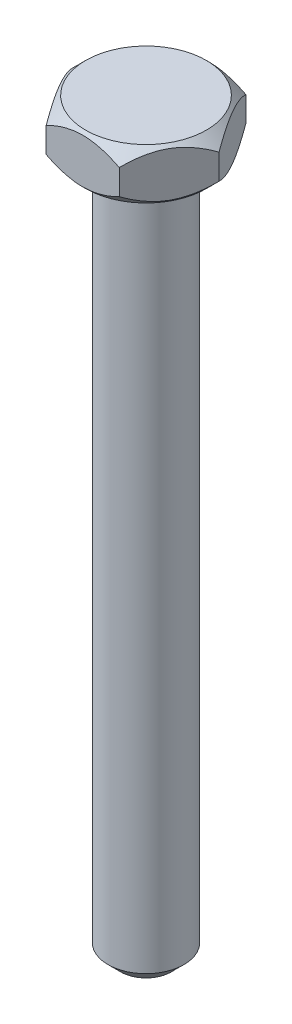
ISO-10303-21;
HEADER;
FILE_DESCRIPTION(('STEP AP214'),'2;1');
FILE_NAME('part.step','',(''),(''),'','','');
FILE_SCHEMA(('AUTOMOTIVE_DESIGN { 1 0 10303 214 1 1 1 1 }'));
ENDSEC;
DATA;
#1=APPLICATION_CONTEXT('core data for automotive mechanical design processes');
#2=APPLICATION_PROTOCOL_DEFINITION('international standard','automotive_design',2000,#1);
#3=PRODUCT_CONTEXT('',#1,'mechanical');
#4=PRODUCT('Part','Part','',(#3));
#5=PRODUCT_RELATED_PRODUCT_CATEGORY('part','',(#4));
#6=PRODUCT_DEFINITION_FORMATION('','',#4);
#7=PRODUCT_DEFINITION_CONTEXT('part definition',#1,'design');
#8=PRODUCT_DEFINITION('design','',#6,#7);
#9=PRODUCT_DEFINITION_SHAPE('','',#8);
#10=(LENGTH_UNIT() NAMED_UNIT(*) SI_UNIT(.MILLI.,.METRE.));
#11=(NAMED_UNIT(*) PLANE_ANGLE_UNIT() SI_UNIT($,.RADIAN.));
#12=(NAMED_UNIT(*) SI_UNIT($,.STERADIAN.) SOLID_ANGLE_UNIT());
#13=UNCERTAINTY_MEASURE_WITH_UNIT(LENGTH_MEASURE(1.E-05),#10,'distance_accuracy_value','');
#14=(GEOMETRIC_REPRESENTATION_CONTEXT(3) GLOBAL_UNCERTAINTY_ASSIGNED_CONTEXT((#13)) GLOBAL_UNIT_ASSIGNED_CONTEXT((#10,
#11,#12)) REPRESENTATION_CONTEXT('',''));
#15=CARTESIAN_POINT('',(0.,0.,0.));
#16=DIRECTION('',(0.,0.,1.));
#17=DIRECTION('',(1.,0.,0.));
#18=AXIS2_PLACEMENT_3D('',#15,#16,#17);
#19=CARTESIAN_POINT('',(-2.88675134594812,-4.,-4.99999999999999));
#20=DIRECTION('',(0.,-1.,0.));
#21=DIRECTION('',(0.,0.,-1.));
#22=AXIS2_PLACEMENT_3D('',#19,#20,#21);
#23=PLANE('',#22);
#24=CARTESIAN_POINT('',(0.,-4.,0.));
#25=DIRECTION('',(0.,1.,0.));
#26=DIRECTION('',(0.,0.,1.));
#27=AXIS2_PLACEMENT_3D('',#24,#25,#26);
#28=CIRCLE('',#27,4.77350269189625);
#29=CARTESIAN_POINT('',(0.,-4.,4.77350269189625));
#30=VERTEX_POINT('',#29);
#31=EDGE_CURVE('E101',#30,#30,#28,.T.);
#32=ORIENTED_EDGE('',*,*,#31,.F.);
#33=EDGE_LOOP('',(#32));
#34=FACE_BOUND('',#33,.T.);
#35=CARTESIAN_POINT('',(0.,-4.,0.));
#36=DIRECTION('',(0.,-1.,0.));
#37=DIRECTION('',(0.,0.,-1.));
#38=AXIS2_PLACEMENT_3D('',#35,#36,#37);
#39=CIRCLE('',#38,3.);
#40=CARTESIAN_POINT('',(0.,-4.,-3.));
#41=VERTEX_POINT('',#40);
#42=EDGE_CURVE('E115',#41,#41,#39,.T.);
#43=ORIENTED_EDGE('',*,*,#42,.F.);
#44=EDGE_LOOP('',(#43));
#45=FACE_BOUND('',#44,.T.);
#46=ADVANCED_FACE('F28',(#34,#45),#23,.T.);
#47=CARTESIAN_POINT('',(0.,-59.,0.));
#48=DIRECTION('',(0.,1.,0.));
#49=DIRECTION('',(0.,0.,1.));
#50=AXIS2_PLACEMENT_3D('',#47,#48,#49);
#51=CYLINDRICAL_SURFACE('',#50,3.);
#52=CARTESIAN_POINT('',(0.,-58.,0.));
#53=DIRECTION('',(0.,-1.,0.));
#54=DIRECTION('',(0.,0.,-1.));
#55=AXIS2_PLACEMENT_3D('',#52,#53,#54);
#56=CIRCLE('',#55,3.);
#57=CARTESIAN_POINT('',(0.,-58.,-3.));
#58=VERTEX_POINT('',#57);
#59=EDGE_CURVE('E41',#58,#58,#56,.F.);
#60=ORIENTED_EDGE('',*,*,#59,.T.);
#61=EDGE_LOOP('',(#60));
#62=FACE_BOUND('',#61,.T.);
#63=ORIENTED_EDGE('',*,*,#42,.T.);
#64=EDGE_LOOP('',(#63));
#65=FACE_BOUND('',#64,.T.);
#66=ADVANCED_FACE('F122',(#62,#65),#51,.T.);
#67=CARTESIAN_POINT('',(0.,-59.,0.));
#68=DIRECTION('',(0.,-1.,0.));
#69=DIRECTION('',(0.,0.,-1.));
#70=AXIS2_PLACEMENT_3D('',#67,#68,#69);
#71=PLANE('',#70);
#72=CARTESIAN_POINT('',(0.,-59.,0.));
#73=DIRECTION('',(0.,-1.,0.));
#74=DIRECTION('',(0.,0.,-1.));
#75=AXIS2_PLACEMENT_3D('',#72,#73,#74);
#76=CIRCLE('',#75,2.00000000000001);
#77=CARTESIAN_POINT('',(0.,-59.,-2.00000000000001));
#78=VERTEX_POINT('',#77);
#79=EDGE_CURVE('E116',#78,#78,#76,.T.);
#80=ORIENTED_EDGE('',*,*,#79,.T.);
#81=EDGE_LOOP('',(#80));
#82=FACE_BOUND('',#81,.T.);
#83=ADVANCED_FACE('F128',(#82),#71,.T.);
#84=CARTESIAN_POINT('',(0.,-59.,0.));
#85=DIRECTION('',(0.,1.,0.));
#86=DIRECTION('',(0.,0.,1.));
#87=AXIS2_PLACEMENT_3D('',#84,#85,#86);
#88=CONICAL_SURFACE('',#87,2.00000000000001,0.785398163397447);
#89=ORIENTED_EDGE('',*,*,#59,.F.);
#90=EDGE_LOOP('',(#89));
#91=FACE_BOUND('',#90,.T.);
#92=ORIENTED_EDGE('',*,*,#79,.F.);
#93=EDGE_LOOP('',(#92));
#94=FACE_BOUND('',#93,.T.);
#95=ADVANCED_FACE('F125',(#91,#94),#88,.T.);
#96=CARTESIAN_POINT('',(0.,-4.,0.));
#97=DIRECTION('',(0.,1.,0.));
#98=DIRECTION('',(0.,0.,1.));
#99=AXIS2_PLACEMENT_3D('',#96,#97,#98);
#100=CONICAL_SURFACE('',#99,4.77350269189625,0.785398163397448);
#101=CARTESIAN_POINT('',(-5.77361816195009,-2.99988452648213,0.000200000000039934));
#102=CARTESIAN_POINT('',(-5.72398176110225,-3.04951645439574,-0.0857727681732677));
#103=CARTESIAN_POINT('',(-5.6739638280717,-3.0976252747131,-0.17240636947177));
#104=CARTESIAN_POINT('',(-5.57309004377303,-3.19033336867022,-0.3471248890288));
#105=CARTESIAN_POINT('',(-5.52223375293569,-3.23493072549852,-0.435210568643571));
#106=CARTESIAN_POINT('',(-5.36782257743899,-3.36314092787175,-0.702658569860292));
#107=CARTESIAN_POINT('',(-5.26296050943971,-3.44062493449848,-0.884284999421792));
#108=CARTESIAN_POINT('',(-5.05149774994706,-3.57331105557449,-1.25054924277179));
#109=CARTESIAN_POINT('',(-4.94495110937142,-3.62884745935417,-1.43509343762457));
#110=CARTESIAN_POINT('',(-4.78337944338746,-3.69308950595249,-1.71494377217234));
#111=CARTESIAN_POINT('',(-4.72928433986568,-3.71131783666137,-1.80863923991277));
#112=CARTESIAN_POINT('',(-4.62063609179559,-3.74100781287389,-1.9968235257235));
#113=CARTESIAN_POINT('',(-4.56608301694085,-3.75247046969492,-2.09131222308102));
#114=CARTESIAN_POINT('',(-4.43314578685872,-3.77168913825403,-2.32156625980075));
#115=CARTESIAN_POINT('',(-4.35461839928598,-3.7757217117403,-2.4575796848624));
#116=CARTESIAN_POINT('',(-4.19770514602325,-3.7689541458947,-2.72936141189436));
#117=CARTESIAN_POINT('',(-4.11931933958609,-3.75814880702901,-2.86512961123579));
#118=CARTESIAN_POINT('',(-3.96328672226451,-3.72234235010197,-3.13538603207472));
#119=CARTESIAN_POINT('',(-3.88564083675503,-3.69732535604175,-3.26987265077581));
#120=CARTESIAN_POINT('',(-3.73168360440634,-3.63445567501058,-3.53653439939643));
#121=CARTESIAN_POINT('',(-3.65537215571136,-3.59660397223245,-3.66870970573533));
#122=CARTESIAN_POINT('',(-3.51990355411976,-3.51873011323948,-3.90334820652228));
#123=CARTESIAN_POINT('',(-3.4604464736886,-3.480755749581,-4.00633089069876));
#124=CARTESIAN_POINT('',(-3.34259967462161,-3.39868737382607,-4.21044753419214));
#125=CARTESIAN_POINT('',(-3.28420998845894,-3.35459317589646,-4.31158143726389));
#126=CARTESIAN_POINT('',(-3.16868188148908,-3.26127361464765,-4.51168198823795));
#127=CARTESIAN_POINT('',(-3.11154017495448,-3.21206438729062,-4.61065432718707));
#128=CARTESIAN_POINT('',(-2.99831490663731,-3.109160877157,-4.80676624461303));
#129=CARTESIAN_POINT('',(-2.94223072132828,-3.05546934545098,-4.90390690306937));
#130=CARTESIAN_POINT('',(-2.88663587589429,-2.99988452648214,-5.00019999999999));
#131=B_SPLINE_CURVE_WITH_KNOTS('',3,(#101,#102,#103,#104,#105,#106,#107,#108,#109,#110,#111,
#112,#113,#114,#115,#116,#117,#118,#119,#120,#121,#122,#123,#124,#125,#126,#127,#128,#129,#130),
.UNSPECIFIED.,.F.,.F.,(4,2,2,2,2,2,2,2,2,2,2,2,2,2,4),(0.,0.332945616209569,0.666071736106993,
1.33592065243335,1.99513262597482,2.32409207808825,2.65300234563692,3.12358963991984,
3.59434188052354,4.06562104077027,4.5368640704961,4.91117956742317,5.28550643319671,
5.65868635377117,6.03163889109475),.UNSPECIFIED.);
#132=CARTESIAN_POINT('',(-5.77350269189625,-3.,0.));
#133=VERTEX_POINT('',#132);
#134=CARTESIAN_POINT('',(-2.88675134594813,-3.,-4.99999999999999));
#135=VERTEX_POINT('',#134);
#136=EDGE_CURVE('E173',#133,#135,#131,.T.);
#137=ORIENTED_EDGE('',*,*,#136,.T.);
#138=CARTESIAN_POINT('',(-5.93336867910423,-1.0143233614403,-4.99999999999999));
#139=CARTESIAN_POINT('',(-5.78966341948587,-1.1241885817879,-4.99999999999999));
#140=CARTESIAN_POINT('',(-5.64517359422455,-1.23304389822759,-4.99999999999999));
#141=CARTESIAN_POINT('',(-5.35430787651161,-1.44827641705777,-4.99999999999999));
#142=CARTESIAN_POINT('',(-5.20793153723386,-1.55465301495845,-4.99999999999999));
#143=CARTESIAN_POINT('',(-4.9119053610751,-1.76522692025996,-4.99999999999999));
#144=CARTESIAN_POINT('',(-4.7622389674382,-1.86940102910427,-4.99999999999999));
#145=CARTESIAN_POINT('',(-4.4603979301907,-2.07403749362642,-4.99999999999999));
#146=CARTESIAN_POINT('',(-4.30822346176151,-2.17450010696542,-4.99999999999999));
#147=CARTESIAN_POINT('',(-3.99153933620166,-2.37689028562685,-4.99999999999999));
#148=CARTESIAN_POINT('',(-3.82684512877714,-2.47853053625136,-4.99999999999999));
#149=CARTESIAN_POINT('',(-3.49359569305951,-2.67537782448448,-4.99999999999999));
#150=CARTESIAN_POINT('',(-3.32503983391761,-2.77058380079454,-4.99999999999999));
#151=CARTESIAN_POINT('',(-2.98404180965613,-2.95252582018176,-4.99999999999999));
#152=CARTESIAN_POINT('',(-2.81161302726992,-3.03928674909056,-4.99999999999999));
#153=CARTESIAN_POINT('',(-2.4619377508861,-3.20239520740955,-4.99999999999999));
#154=CARTESIAN_POINT('',(-2.28469354573479,-3.27874758379917,-4.99999999999999));
#155=CARTESIAN_POINT('',(-1.94171568558995,-3.41181755173878,-4.99999999999999));
#156=CARTESIAN_POINT('',(-1.77643834256962,-3.46969922851381,-4.99999999999999));
#157=CARTESIAN_POINT('',(-1.44175059438624,-3.57222452709261,-4.99999999999999));
#158=CARTESIAN_POINT('',(-1.27233991994473,-3.61686728390092,-4.99999999999999));
#159=CARTESIAN_POINT('',(-0.933301891878295,-3.68978435588989,-4.99999999999999));
#160=CARTESIAN_POINT('',(-0.763738295172394,-3.71835018807338,-4.99999999999999));
#161=CARTESIAN_POINT('',(-0.422603458667702,-3.75853073066782,-4.99999999999999));
#162=CARTESIAN_POINT('',(-0.251032616590633,-3.7701487436941,-4.99999999999999));
#163=CARTESIAN_POINT('',(0.0853406388539586,-3.77548648250807,-4.99999999999999));
#164=CARTESIAN_POINT('',(0.250131876658651,-3.76992113564033,-4.99999999999999));
#165=CARTESIAN_POINT('',(0.578387101858167,-3.74282076274746,-4.99999999999999));
#166=CARTESIAN_POINT('',(0.741850964252607,-3.72128424993436,-4.99999999999999));
#167=CARTESIAN_POINT('',(1.06903592592894,-3.66307865086045,-4.99999999999999));
#168=CARTESIAN_POINT('',(1.23270929845992,-3.62614570544629,-4.99999999999999));
#169=CARTESIAN_POINT('',(1.55646565066118,-3.53916921466345,-4.99999999999999));
#170=CARTESIAN_POINT('',(1.71654886698276,-3.48912653621913,-4.99999999999999));
#171=CARTESIAN_POINT('',(2.04376834721888,-3.37425220624934,-4.99999999999999));
#172=CARTESIAN_POINT('',(2.21062650526836,-3.30863700466564,-4.99999999999999));
#173=CARTESIAN_POINT('',(2.54003854131556,-3.16728810798752,-4.99999999999999));
#174=CARTESIAN_POINT('',(2.7025904176521,-3.0915498029936,-4.99999999999999));
#175=CARTESIAN_POINT('',(3.02416565802373,-2.9317524021677,-4.99999999999999));
#176=CARTESIAN_POINT('',(3.1831761026048,-2.84766751767455,-4.99999999999999));
#177=CARTESIAN_POINT('',(3.49754870709798,-2.67302987151769,-4.99999999999999));
#178=CARTESIAN_POINT('',(3.65291142946937,-2.58247811583028,-4.99999999999999));
#179=CARTESIAN_POINT('',(3.95285892432342,-2.40078159251411,-4.99999999999999));
#180=CARTESIAN_POINT('',(4.09759659911003,-2.30988790532247,-4.99999999999999));
#181=CARTESIAN_POINT('',(4.38458573992775,-2.12424528238796,-4.99999999999999));
#182=CARTESIAN_POINT('',(4.52683701776729,-2.02949605661615,-4.99999999999999));
#183=CARTESIAN_POINT('',(4.80803186770968,-1.83760520698687,-4.99999999999999));
#184=CARTESIAN_POINT('',(4.94699285705844,-1.74048901451515,-4.99999999999999));
#185=CARTESIAN_POINT('',(5.22301057132509,-1.54366358089934,-4.99999999999999));
#186=CARTESIAN_POINT('',(5.36006781033932,-1.44395506153836,-4.99999999999999));
#187=CARTESIAN_POINT('',(5.49632687048856,-1.34318580314551,-4.99999999999999));
#188=B_SPLINE_CURVE_WITH_KNOTS('',3,(#138,#139,#140,#141,#142,#143,#144,#145,#146,#147,#148,
#149,#150,#151,#152,#153,#154,#155,#156,#157,#158,#159,#160,#161,#162,#163,#164,#165,#166,#167,
#168,#169,#170,#171,#172,#173,#174,#175,#176,#177,#178,#179,#180,#181,#182,#183,#184,#185,#186,
#187),.UNSPECIFIED.,.F.,.F.,(4,2,2,2,2,2,2,2,2,2,2,2,2,2,2,2,2,2,2,2,2,2,2,2,4),(0.,
0.542683335711663,1.08549766009344,1.63250741832322,2.17947913015188,2.75996048819956,
3.34053736097748,3.91934802264124,4.49788822043794,5.02279153401111,5.54772913580436,
6.06281331680062,6.57779711011592,7.0716474990381,7.56554386725873,8.06827708076712,
8.57097705777059,9.10845041736518,9.64616937298291,10.1856047538602,10.7249564030361,
11.2376185039342,11.7503192408631,12.2588884723274,12.7673175877714),.UNSPECIFIED.);
#189=CARTESIAN_POINT('',(2.88675134594814,-3.,-4.99999999999999));
#190=VERTEX_POINT('',#189);
#191=EDGE_CURVE('E167',#135,#190,#188,.T.);
#192=ORIENTED_EDGE('',*,*,#191,.T.);
#193=CARTESIAN_POINT('',(2.8866358758943,-2.99988452648213,-5.00019999999999));
#194=CARTESIAN_POINT('',(2.93627227674214,-3.04951645439574,-4.91422723182668));
#195=CARTESIAN_POINT('',(2.98629020977269,-3.09762527471309,-4.82759363052818));
#196=CARTESIAN_POINT('',(3.08716399407136,-3.19033336867022,-4.65287511097115));
#197=CARTESIAN_POINT('',(3.1380202849087,-3.23493072549851,-4.56478943135638));
#198=CARTESIAN_POINT('',(3.2924314604054,-3.36314092787174,-4.29734143013966));
#199=CARTESIAN_POINT('',(3.39729352840468,-3.44062493449848,-4.11571500057816));
#200=CARTESIAN_POINT('',(3.60875628789733,-3.57331105557448,-3.74945075722817));
#201=CARTESIAN_POINT('',(3.71530292847297,-3.62884745935416,-3.56490656237539));
#202=CARTESIAN_POINT('',(3.87687459445693,-3.69308950595248,-3.28505622782762));
#203=CARTESIAN_POINT('',(3.93096969797871,-3.71131783666136,-3.1913607600872));
#204=CARTESIAN_POINT('',(4.03961794604879,-3.74100781287387,-3.00317647427646));
#205=CARTESIAN_POINT('',(4.09417102090353,-3.75247046969491,-2.90868777691894));
#206=CARTESIAN_POINT('',(4.22710825098566,-3.77168913825401,-2.67843374019922));
#207=CARTESIAN_POINT('',(4.30563563855841,-3.77572171174028,-2.54242031513757));
#208=CARTESIAN_POINT('',(4.46254889182113,-3.76895414589469,-2.2706385881056));
#209=CARTESIAN_POINT('',(4.5409346982583,-3.758148807029,-2.13487038876418));
#210=CARTESIAN_POINT('',(4.69696731557988,-3.72234235010196,-1.86461396792524));
#211=CARTESIAN_POINT('',(4.77461320108935,-3.69732535604173,-1.73012734922416));
#212=CARTESIAN_POINT('',(4.92857043343804,-3.63445567501056,-1.46346560060354));
#213=CARTESIAN_POINT('',(5.00488188213303,-3.59660397223244,-1.33129029426463));
#214=CARTESIAN_POINT('',(5.14035048372462,-3.51873011323946,-1.09665179347768));
#215=CARTESIAN_POINT('',(5.19980756415579,-3.48075574958098,-0.993669109301198));
#216=CARTESIAN_POINT('',(5.31765436322278,-3.39868737382605,-0.789552465807815));
#217=CARTESIAN_POINT('',(5.37604404938545,-3.35459317589644,-0.688418562736064));
#218=CARTESIAN_POINT('',(5.49157215635532,-3.26127361464763,-0.488318011762002));
#219=CARTESIAN_POINT('',(5.54871386288992,-3.21206438729059,-0.389345672812883));
#220=CARTESIAN_POINT('',(5.66193913120709,-3.10916087715698,-0.193233755386925));
#221=CARTESIAN_POINT('',(5.71802331651611,-3.05546934545096,-0.0960930969305827));
#222=CARTESIAN_POINT('',(5.77361816195011,-2.99988452648211,0.00020000000003889));
#223=B_SPLINE_CURVE_WITH_KNOTS('',3,(#193,#194,#195,#196,#197,#198,#199,#200,#201,#202,#203,
#204,#205,#206,#207,#208,#209,#210,#211,#212,#213,#214,#215,#216,#217,#218,#219,#220,#221,#222),
.UNSPECIFIED.,.F.,.F.,(4,2,2,2,2,2,2,2,2,2,2,2,2,2,4),(0.,0.332945616209567,0.666071736106988,
1.33592065243334,1.99513262597481,2.32409207808823,2.6530023456369,3.12358963991982,
3.59434188052352,4.06562104077025,4.53686407049609,4.91117956742316,5.28550643319671,
5.65868635377117,6.03163889109475),.UNSPECIFIED.);
#224=CARTESIAN_POINT('',(5.77350269189625,-3.,0.));
#225=VERTEX_POINT('',#224);
#226=EDGE_CURVE('E89',#190,#225,#223,.T.);
#227=ORIENTED_EDGE('',*,*,#226,.T.);
#228=CARTESIAN_POINT('',(5.77361816195011,-2.99988452648211,-0.000199999999961444));
#229=CARTESIAN_POINT('',(5.72398176110227,-3.04951645439572,0.0857727681733453));
#230=CARTESIAN_POINT('',(5.67396382807171,-3.09762527471308,0.172406369471846));
#231=CARTESIAN_POINT('',(5.57309004377305,-3.1903333686702,0.347124889028875));
#232=CARTESIAN_POINT('',(5.52223375293571,-3.23493072549849,0.435210568643645));
#233=CARTESIAN_POINT('',(5.36782257743901,-3.36314092787172,0.702658569860364));
#234=CARTESIAN_POINT('',(5.26296050943973,-3.44062493449846,0.884284999421862));
#235=CARTESIAN_POINT('',(5.05149774994707,-3.57331105557446,1.25054924277185));
#236=CARTESIAN_POINT('',(4.94495110937143,-3.62884745935414,1.43509343762464));
#237=CARTESIAN_POINT('',(4.78337944338747,-3.69308950595246,1.71494377217241));
#238=CARTESIAN_POINT('',(4.72928433986569,-3.71131783666134,1.80863923991283));
#239=CARTESIAN_POINT('',(4.62063609179561,-3.74100781287386,1.99682352572356));
#240=CARTESIAN_POINT('',(4.56608301694086,-3.75247046969489,2.09131222308108));
#241=CARTESIAN_POINT('',(4.43314578685873,-3.77168913825399,2.3215662598008));
#242=CARTESIAN_POINT('',(4.35461839928598,-3.77572171174026,2.45757968486246));
#243=CARTESIAN_POINT('',(4.19770514602326,-3.76895414589467,2.72936141189442));
#244=CARTESIAN_POINT('',(4.11931933958609,-3.75814880702898,2.86512961123585));
#245=CARTESIAN_POINT('',(3.96328672226451,-3.72234235010194,3.13538603207478));
#246=CARTESIAN_POINT('',(3.88564083675503,-3.69732535604171,3.26987265077587));
#247=CARTESIAN_POINT('',(3.73168360440634,-3.63445567501054,3.53653439939649));
#248=CARTESIAN_POINT('',(3.65537215571135,-3.59660397223242,3.66870970573539));
#249=CARTESIAN_POINT('',(3.51990355411976,-3.51873011323944,3.90334820652233));
#250=CARTESIAN_POINT('',(3.4604464736886,-3.48075574958096,4.00633089069881));
#251=CARTESIAN_POINT('',(3.34259967462161,-3.39868737382603,4.21044753419218));
#252=CARTESIAN_POINT('',(3.28420998845894,-3.35459317589643,4.31158143726393));
#253=CARTESIAN_POINT('',(3.16868188148908,-3.26127361464762,4.51168198823798));
#254=CARTESIAN_POINT('',(3.11154017495448,-3.21206438729059,4.6106543271871));
#255=CARTESIAN_POINT('',(2.99831490663731,-3.10916087715698,4.80676624461305));
#256=CARTESIAN_POINT('',(2.94223072132829,-3.05546934545097,4.90390690306938));
#257=CARTESIAN_POINT('',(2.8866358758943,-2.99988452648212,5.0002));
#258=B_SPLINE_CURVE_WITH_KNOTS('',3,(#228,#229,#230,#231,#232,#233,#234,#235,#236,#237,#238,
#239,#240,#241,#242,#243,#244,#245,#246,#247,#248,#249,#250,#251,#252,#253,#254,#255,#256,#257),
.UNSPECIFIED.,.F.,.F.,(4,2,2,2,2,2,2,2,2,2,2,2,2,2,4),(0.,0.332945616209566,0.666071736106988,
1.33592065243334,1.99513262597481,2.32409207808823,2.6530023456369,3.12358963991982,
3.59434188052353,4.06562104077026,4.5368640704961,4.91117956742315,5.28550643319668,
5.65868635377112,6.03163889109469),.UNSPECIFIED.);
#259=CARTESIAN_POINT('',(2.88675134594812,-3.,5.));
#260=VERTEX_POINT('',#259);
#261=EDGE_CURVE('E85',#225,#260,#258,.T.);
#262=ORIENTED_EDGE('',*,*,#261,.T.);
#263=CARTESIAN_POINT('',(-5.93336867913979,-1.01432336141309,5.));
#264=CARTESIAN_POINT('',(-5.78966341952042,-1.12418858176174,5.));
#265=CARTESIAN_POINT('',(-5.64517359425808,-1.23304389820249,5.));
#266=CARTESIAN_POINT('',(-5.35430787654308,-1.44827641703476,5.));
#267=CARTESIAN_POINT('',(-5.20793153726431,-1.55465301493648,5.));
#268=CARTESIAN_POINT('',(-4.91190536110345,-1.76522692024009,5.));
#269=CARTESIAN_POINT('',(-4.76223896746549,-1.86940102908545,5.));
#270=CARTESIAN_POINT('',(-4.46039793021584,-2.07403749360968,5.));
#271=CARTESIAN_POINT('',(-4.30822346178557,-2.17450010694972,5.));
#272=CARTESIAN_POINT('',(-3.99153933622338,-2.37689028561331,5.));
#273=CARTESIAN_POINT('',(-3.82684512879759,-2.47853053623893,5.));
#274=CARTESIAN_POINT('',(-3.49359569307741,-2.67537782447423,5.));
#275=CARTESIAN_POINT('',(-3.3250398339342,-2.77058380078536,5.));
#276=CARTESIAN_POINT('',(-2.98404180967006,-2.95252582017463,5.));
#277=CARTESIAN_POINT('',(-2.81161302728251,-3.0392867490844,5.));
#278=CARTESIAN_POINT('',(-2.46193775089592,-3.20239520740523,5.));
#279=CARTESIAN_POINT('',(-2.28469354574318,-3.2787475837957,5.));
#280=CARTESIAN_POINT('',(-1.94171568559774,-3.41181755173593,5.));
#281=CARTESIAN_POINT('',(-1.7764383425783,-3.46969922851087,5.));
#282=CARTESIAN_POINT('',(-1.44175059439672,-3.57222452708967,5.));
#283=CARTESIAN_POINT('',(-1.27233991995613,-3.61686728389806,5.));
#284=CARTESIAN_POINT('',(-0.933301891891501,-3.68978435588743,5.));
#285=CARTESIAN_POINT('',(-0.763738295186488,-3.71835018807121,5.));
#286=CARTESIAN_POINT('',(-0.422603458683547,-3.75853073066644,5.));
#287=CARTESIAN_POINT('',(-0.251032616607341,-3.77014874369322,5.));
#288=CARTESIAN_POINT('',(0.0853406388357411,-3.77548648250835,5.));
#289=CARTESIAN_POINT('',(0.250131876639783,-3.76992113564124,5.));
#290=CARTESIAN_POINT('',(0.578387101838071,-3.74282076274974,5.));
#291=CARTESIAN_POINT('',(0.741850964231932,-3.72128424993737,5.));
#292=CARTESIAN_POINT('',(1.06903592590712,-3.66307865086499,5.));
#293=CARTESIAN_POINT('',(1.23270929843754,-3.62614570545163,5.));
#294=CARTESIAN_POINT('',(1.55646565063773,-3.5391692146704,5.));
#295=CARTESIAN_POINT('',(1.71654886695881,-3.4891265362269,5.));
#296=CARTESIAN_POINT('',(2.04376834719211,-3.3742522062594,5.));
#297=CARTESIAN_POINT('',(2.21062650523935,-3.30863700467733,5.));
#298=CARTESIAN_POINT('',(2.54003854128215,-3.16728810800261,5.));
#299=CARTESIAN_POINT('',(2.70259041761655,-3.09154980301047,5.));
#300=CARTESIAN_POINT('',(3.02416565798398,-2.93175240218824,5.));
#301=CARTESIAN_POINT('',(3.18317610256299,-2.84766751769698,5.));
#302=CARTESIAN_POINT('',(3.49754870705211,-2.67302987154396,5.));
#303=CARTESIAN_POINT('',(3.65291142942151,-2.58247811585849,5.));
#304=CARTESIAN_POINT('',(3.95285892427193,-2.40078159254602,5.));
#305=CARTESIAN_POINT('',(4.09759659905692,-2.30988790535612,5.));
#306=CARTESIAN_POINT('',(4.38458573987138,-2.1242452824251,5.));
#307=CARTESIAN_POINT('',(4.52683701770932,-2.02949605665505,5.));
#308=CARTESIAN_POINT('',(4.80803186764853,-1.83760520702925,5.));
#309=CARTESIAN_POINT('',(4.94699285699572,-1.74048901455926,5.));
#310=CARTESIAN_POINT('',(5.22301057125923,-1.54366358094691,5.));
#311=CARTESIAN_POINT('',(5.3600678102719,-1.44395506158765,5.));
#312=CARTESIAN_POINT('',(5.49632687041958,-1.34318580319653,5.));
#313=B_SPLINE_CURVE_WITH_KNOTS('',3,(#263,#264,#265,#266,#267,#268,#269,#270,#271,#272,#273,
#274,#275,#276,#277,#278,#279,#280,#281,#282,#283,#284,#285,#286,#287,#288,#289,#290,#291,#292,
#293,#294,#295,#296,#297,#298,#299,#300,#301,#302,#303,#304,#305,#306,#307,#308,#309,#310,#311,
#312),.UNSPECIFIED.,.F.,.F.,(4,2,2,2,2,2,2,2,2,2,2,2,2,2,2,2,2,2,2,2,2,2,2,2,4),(0.,
0.542683335716004,1.08549766010212,1.63250741833633,2.17947913016941,2.75996048822207,
3.34053736100496,3.91934802267365,4.49788822047528,5.02279153404586,5.54772913583653,
6.06281331683033,6.57779711014316,7.07164749906334,7.56554386728196,8.06827708078817,
8.57097705778948,9.108450417376,9.64616937298566,10.1856047538548,10.7249564030226,
11.2376185039138,11.7503192408357,12.2588884722932,12.7673175877304),.UNSPECIFIED.);
#314=CARTESIAN_POINT('',(-2.88675134594811,-3.,5.));
#315=VERTEX_POINT('',#314);
#316=EDGE_CURVE('E47',#260,#315,#313,.F.);
#317=ORIENTED_EDGE('',*,*,#316,.T.);
#318=CARTESIAN_POINT('',(-2.88663587589427,-2.99988452648213,5.0002));
#319=CARTESIAN_POINT('',(-2.93627227674211,-3.04951645439574,4.9142272318267));
#320=CARTESIAN_POINT('',(-2.98629020977267,-3.0976252747131,4.82759363052819));
#321=CARTESIAN_POINT('',(-3.08716399407133,-3.19033336867022,4.65287511097117));
#322=CARTESIAN_POINT('',(-3.13802028490867,-3.23493072549851,4.5647894313564));
#323=CARTESIAN_POINT('',(-3.29243146040537,-3.36314092787174,4.29734143013968));
#324=CARTESIAN_POINT('',(-3.39729352840465,-3.44062493449848,4.11571500057818));
#325=CARTESIAN_POINT('',(-3.60875628789731,-3.57331105557448,3.74945075722819));
#326=CARTESIAN_POINT('',(-3.71530292847294,-3.62884745935416,3.56490656237541));
#327=CARTESIAN_POINT('',(-3.8768745944569,-3.69308950595248,3.28505622782764));
#328=CARTESIAN_POINT('',(-3.93096969797869,-3.71131783666136,3.19136076008722));
#329=CARTESIAN_POINT('',(-4.03961794604877,-3.74100781287387,3.00317647427649));
#330=CARTESIAN_POINT('',(-4.09417102090351,-3.75247046969491,2.90868777691897));
#331=CARTESIAN_POINT('',(-4.22710825098564,-3.77168913825401,2.67843374019925));
#332=CARTESIAN_POINT('',(-4.30563563855839,-3.77572171174028,2.5424203151376));
#333=CARTESIAN_POINT('',(-4.46254889182112,-3.76895414589469,2.27063858810564));
#334=CARTESIAN_POINT('',(-4.54093469825828,-3.758148807029,2.13487038876421));
#335=CARTESIAN_POINT('',(-4.69696731557987,-3.72234235010196,1.86461396792528));
#336=CARTESIAN_POINT('',(-4.77461320108934,-3.69732535604173,1.73012734922419));
#337=CARTESIAN_POINT('',(-4.92857043343803,-3.63445567501056,1.46346560060357));
#338=CARTESIAN_POINT('',(-5.00488188213302,-3.59660397223243,1.33129029426467));
#339=CARTESIAN_POINT('',(-5.14035048372461,-3.51873011323946,1.09665179347773));
#340=CARTESIAN_POINT('',(-5.19980756415578,-3.48075574958098,0.993669109301244));
#341=CARTESIAN_POINT('',(-5.31765436322276,-3.39868737382605,0.789552465807868));
#342=CARTESIAN_POINT('',(-5.37604404938544,-3.35459317589644,0.68841856273612));
#343=CARTESIAN_POINT('',(-5.4915721563553,-3.26127361464764,0.488318011762065));
#344=CARTESIAN_POINT('',(-5.5487138628899,-3.21206438729061,0.389345672812949));
#345=CARTESIAN_POINT('',(-5.66193913120707,-3.10916087715699,0.193233755386997));
#346=CARTESIAN_POINT('',(-5.71802331651609,-3.05546934545098,0.0960930969306584));
#347=CARTESIAN_POINT('',(-5.77361816195009,-2.99988452648213,-0.000199999999959808));
#348=B_SPLINE_CURVE_WITH_KNOTS('',3,(#318,#319,#320,#321,#322,#323,#324,#325,#326,#327,#328,
#329,#330,#331,#332,#333,#334,#335,#336,#337,#338,#339,#340,#341,#342,#343,#344,#345,#346,#347),
.UNSPECIFIED.,.F.,.F.,(4,2,2,2,2,2,2,2,2,2,2,2,2,2,4),(0.,0.332945616209565,0.666071736106984,
1.33592065243333,1.9951326259748,2.32409207808822,2.65300234563688,3.12358963991981,
3.59434188052351,4.06562104077024,4.53686407049607,4.91117956742313,5.28550643319667,
5.65868635377112,6.03163889109469),.UNSPECIFIED.);
#349=EDGE_CURVE('E11',#315,#133,#348,.T.);
#350=ORIENTED_EDGE('',*,*,#349,.T.);
#351=EDGE_LOOP('',(#137,#192,#227,#262,#317,#350));
#352=FACE_BOUND('',#351,.T.);
#353=ORIENTED_EDGE('',*,*,#31,.T.);
#354=EDGE_LOOP('',(#353));
#355=FACE_BOUND('',#354,.T.);
#356=ADVANCED_FACE('F86',(#352,#355),#100,.T.);
#357=CARTESIAN_POINT('',(-2.88675134594812,0.,-4.99999999999999));
#358=DIRECTION('',(0.,-1.,0.));
#359=DIRECTION('',(0.,0.,-1.));
#360=AXIS2_PLACEMENT_3D('',#357,#358,#359);
#361=PLANE('',#360);
#362=CARTESIAN_POINT('',(0.,0.,0.));
#363=DIRECTION('',(0.,1.,0.));
#364=DIRECTION('',(0.,0.,1.));
#365=AXIS2_PLACEMENT_3D('',#362,#363,#364);
#366=CIRCLE('',#365,4.77350269189625);
#367=CARTESIAN_POINT('',(0.,0.,4.77350269189625));
#368=VERTEX_POINT('',#367);
#369=EDGE_CURVE('E233',#368,#368,#366,.T.);
#370=ORIENTED_EDGE('',*,*,#369,.T.);
#371=EDGE_LOOP('',(#370));
#372=FACE_BOUND('',#371,.T.);
#373=ADVANCED_FACE('F148',(#372),#361,.F.);
#374=CARTESIAN_POINT('',(0.,-1.,0.));
#375=DIRECTION('',(0.,-1.,0.));
#376=DIRECTION('',(0.,0.,-1.));
#377=AXIS2_PLACEMENT_3D('',#374,#375,#376);
#378=CONICAL_SURFACE('',#377,5.77350269189625,0.785398163397448);
#379=CARTESIAN_POINT('',(-2.88663587589429,-1.00011547351786,-5.00019999999999));
#380=CARTESIAN_POINT('',(-2.93627227674212,-0.950483545604256,-4.91422723182668));
#381=CARTESIAN_POINT('',(-2.98629020977268,-0.9023747252869,-4.82759363052818));
#382=CARTESIAN_POINT('',(-3.08716399407134,-0.809666631329773,-4.65287511097115));
#383=CARTESIAN_POINT('',(-3.13802028490868,-0.76506927450148,-4.56478943135638));
#384=CARTESIAN_POINT('',(-3.29243146040538,-0.636859072128249,-4.29734143013966));
#385=CARTESIAN_POINT('',(-3.39729352840466,-0.559375065501513,-4.11571500057816));
#386=CARTESIAN_POINT('',(-3.60875628789731,-0.426688944425509,-3.74945075722817));
#387=CARTESIAN_POINT('',(-3.71530292847295,-0.371152540645828,-3.56490656237538));
#388=CARTESIAN_POINT('',(-3.87687459445691,-0.306910494047508,-3.28505622782761));
#389=CARTESIAN_POINT('',(-3.93096969797869,-0.288682163338627,-3.19136076008719));
#390=CARTESIAN_POINT('',(-4.03961794604878,-0.258992187126111,-3.00317647427646));
#391=CARTESIAN_POINT('',(-4.09417102090352,-0.247529530305075,-2.90868777691894));
#392=CARTESIAN_POINT('',(-4.22710825098565,-0.228310861745971,-2.67843374019921));
#393=CARTESIAN_POINT('',(-4.30563563855839,-0.224278288259701,-2.54242031513756));
#394=CARTESIAN_POINT('',(-4.46254889182112,-0.231045854105298,-2.2706385881056));
#395=CARTESIAN_POINT('',(-4.54093469825828,-0.241851192970985,-2.13487038876417));
#396=CARTESIAN_POINT('',(-4.69696731557986,-0.277657649898025,-1.86461396792524));
#397=CARTESIAN_POINT('',(-4.77461320108934,-0.30267464395825,-1.73012734922415));
#398=CARTESIAN_POINT('',(-4.92857043343803,-0.365544324989421,-1.46346560060353));
#399=CARTESIAN_POINT('',(-5.00488188213301,-0.403396027767546,-1.33129029426463));
#400=CARTESIAN_POINT('',(-5.14035048372461,-0.481269886760524,-1.09665179347768));
#401=CARTESIAN_POINT('',(-5.19980756415577,-0.519244250419005,-0.993669109301196));
#402=CARTESIAN_POINT('',(-5.31765436322276,-0.601312626173936,-0.789552465807814));
#403=CARTESIAN_POINT('',(-5.37604404938543,-0.645406824103543,-0.688418562736063));
#404=CARTESIAN_POINT('',(-5.4915721563553,-0.738726385352354,-0.488318011762));
#405=CARTESIAN_POINT('',(-5.5487138628899,-0.787935612709386,-0.389345672812882));
#406=CARTESIAN_POINT('',(-5.66193913120707,-0.890839122843004,-0.193233755386923));
#407=CARTESIAN_POINT('',(-5.71802331651609,-0.94453065454902,-0.096093096930581));
#408=CARTESIAN_POINT('',(-5.77361816195009,-1.00011547351787,0.000200000000039907));
#409=B_SPLINE_CURVE_WITH_KNOTS('',3,(#379,#380,#381,#382,#383,#384,#385,#386,#387,#388,#389,
#390,#391,#392,#393,#394,#395,#396,#397,#398,#399,#400,#401,#402,#403,#404,#405,#406,#407,#408),
.UNSPECIFIED.,.F.,.F.,(4,2,2,2,2,2,2,2,2,2,2,2,2,2,4),(0.,0.332945616209568,0.66607173610699,
1.33592065243334,1.99513262597481,2.32409207808824,2.65300234563691,3.12358963991983,
3.59434188052353,4.06562104077026,4.53686407049609,4.91117956742316,5.28550643319671,
5.65868635377117,6.03163889109475),.UNSPECIFIED.);
#410=CARTESIAN_POINT('',(-2.88675134594813,-1.,-4.99999999999999));
#411=VERTEX_POINT('',#410);
#412=CARTESIAN_POINT('',(-5.77350269189625,-1.,0.));
#413=VERTEX_POINT('',#412);
#414=EDGE_CURVE('E220',#411,#413,#409,.T.);
#415=ORIENTED_EDGE('',*,*,#414,.T.);
#416=CARTESIAN_POINT('',(-5.77361816195009,-1.00011547351787,-0.000199999999960101));
#417=CARTESIAN_POINT('',(-5.72398176110225,-0.950483545604261,0.0857727681733466));
#418=CARTESIAN_POINT('',(-5.6739638280717,-0.902374725286905,0.172406369471848));
#419=CARTESIAN_POINT('',(-5.57309004377303,-0.809666631329781,0.347124889028876));
#420=CARTESIAN_POINT('',(-5.52223375293569,-0.765069274501489,0.435210568643646));
#421=CARTESIAN_POINT('',(-5.36782257743899,-0.636859072128259,0.702658569860363));
#422=CARTESIAN_POINT('',(-5.26296050943971,-0.559375065501524,0.884284999421859));
#423=CARTESIAN_POINT('',(-5.05149774994706,-0.426688944425522,1.25054924277185));
#424=CARTESIAN_POINT('',(-4.94495110937142,-0.371152540645844,1.43509343762463));
#425=CARTESIAN_POINT('',(-4.78337944338746,-0.306910494047524,1.7149437721724));
#426=CARTESIAN_POINT('',(-4.72928433986568,-0.288682163338644,1.80863923991282));
#427=CARTESIAN_POINT('',(-4.62063609179559,-0.258992187126128,1.99682352572355));
#428=CARTESIAN_POINT('',(-4.56608301694085,-0.247529530305091,2.09131222308107));
#429=CARTESIAN_POINT('',(-4.43314578685872,-0.228310861745989,2.32156625980079));
#430=CARTESIAN_POINT('',(-4.35461839928597,-0.22427828825972,2.45757968486244));
#431=CARTESIAN_POINT('',(-4.19770514602324,-0.231045854105316,2.72936141189441));
#432=CARTESIAN_POINT('',(-4.11931933958608,-0.241851192971002,2.86512961123583));
#433=CARTESIAN_POINT('',(-3.96328672226449,-0.277657649898043,3.13538603207477));
#434=CARTESIAN_POINT('',(-3.88564083675502,-0.302674643958268,3.26987265077585));
#435=CARTESIAN_POINT('',(-3.73168360440633,-0.36554432498944,3.53653439939647));
#436=CARTESIAN_POINT('',(-3.65537215571134,-0.403396027767565,3.66870970573538));
#437=CARTESIAN_POINT('',(-3.51990355411974,-0.481269886760541,3.90334820652232));
#438=CARTESIAN_POINT('',(-3.46044647368858,-0.519244250419022,4.0063308906988));
#439=CARTESIAN_POINT('',(-3.3425996746216,-0.601312626173949,4.21044753419218));
#440=CARTESIAN_POINT('',(-3.28420998845893,-0.645406824103555,4.31158143726392));
#441=CARTESIAN_POINT('',(-3.16868188148906,-0.738726385352362,4.51168198823798));
#442=CARTESIAN_POINT('',(-3.11154017495446,-0.787935612709392,4.61065432718709));
#443=CARTESIAN_POINT('',(-2.99831490663729,-0.890839122843006,4.80676624461304));
#444=CARTESIAN_POINT('',(-2.94223072132827,-0.94453065454902,4.90390690306938));
#445=CARTESIAN_POINT('',(-2.88663587589427,-1.00011547351787,5.0002));
#446=B_SPLINE_CURVE_WITH_KNOTS('',3,(#416,#417,#418,#419,#420,#421,#422,#423,#424,#425,#426,
#427,#428,#429,#430,#431,#432,#433,#434,#435,#436,#437,#438,#439,#440,#441,#442,#443,#444,#445),
.UNSPECIFIED.,.F.,.F.,(4,2,2,2,2,2,2,2,2,2,2,2,2,2,4),(0.,0.332945616209565,0.666071736106986,
1.33592065243333,1.9951326259748,2.32409207808822,2.65300234563689,3.12358963991981,
3.59434188052351,4.06562104077024,4.53686407049608,4.91117956742314,5.28550643319667,
5.65868635377112,6.03163889109469),.UNSPECIFIED.);
#447=CARTESIAN_POINT('',(-2.88675134594811,-1.,5.00000000000001));
#448=VERTEX_POINT('',#447);
#449=EDGE_CURVE('E236',#413,#448,#446,.T.);
#450=ORIENTED_EDGE('',*,*,#449,.T.);
#451=CARTESIAN_POINT('',(-5.93336867913979,-2.98567663858691,5.));
#452=CARTESIAN_POINT('',(-5.78966341952042,-2.87581141823826,5.));
#453=CARTESIAN_POINT('',(-5.64517359425808,-2.76695610179751,5.));
#454=CARTESIAN_POINT('',(-5.35430787654308,-2.55172358296524,5.));
#455=CARTESIAN_POINT('',(-5.20793153726431,-2.44534698506352,5.));
#456=CARTESIAN_POINT('',(-4.91190536110346,-2.23477307975991,5.));
#457=CARTESIAN_POINT('',(-4.76223896746549,-2.13059897091455,5.));
#458=CARTESIAN_POINT('',(-4.46039793021584,-1.92596250639032,5.));
#459=CARTESIAN_POINT('',(-4.30822346178557,-1.82549989305028,5.));
#460=CARTESIAN_POINT('',(-3.99153933622338,-1.62310971438669,5.));
#461=CARTESIAN_POINT('',(-3.82684512879759,-1.52146946376107,5.));
#462=CARTESIAN_POINT('',(-3.49359569307741,-1.32462217552577,5.));
#463=CARTESIAN_POINT('',(-3.3250398339342,-1.22941619921464,5.));
#464=CARTESIAN_POINT('',(-2.98404180967006,-1.04747417982537,5.));
#465=CARTESIAN_POINT('',(-2.81161302728251,-0.960713250915597,5.));
#466=CARTESIAN_POINT('',(-2.46193775089592,-0.797604792594766,5.));
#467=CARTESIAN_POINT('',(-2.28469354574318,-0.721252416204296,5.));
#468=CARTESIAN_POINT('',(-1.94171568559774,-0.588182448264071,5.));
#469=CARTESIAN_POINT('',(-1.7764383425783,-0.530300771489132,5.));
#470=CARTESIAN_POINT('',(-1.44175059439672,-0.427775472910332,5.));
#471=CARTESIAN_POINT('',(-1.27233991995613,-0.383132716101937,5.));
#472=CARTESIAN_POINT('',(-0.9333018918915,-0.310215644112575,5.));
#473=CARTESIAN_POINT('',(-0.763738295186488,-0.281649811928794,5.));
#474=CARTESIAN_POINT('',(-0.422603458683547,-0.241469269333559,5.));
#475=CARTESIAN_POINT('',(-0.251032616607341,-0.229851256306779,5.));
#476=CARTESIAN_POINT('',(0.085340638835741,-0.224513517491652,5.));
#477=CARTESIAN_POINT('',(0.250131876639783,-0.230078864358759,5.));
#478=CARTESIAN_POINT('',(0.578387101838071,-0.257179237250259,5.));
#479=CARTESIAN_POINT('',(0.741850964231932,-0.278715750062628,5.));
#480=CARTESIAN_POINT('',(1.06903592590712,-0.336921349135011,5.));
#481=CARTESIAN_POINT('',(1.23270929843754,-0.373854294548371,5.));
#482=CARTESIAN_POINT('',(1.55646565063773,-0.460830785329602,5.));
#483=CARTESIAN_POINT('',(1.71654886695881,-0.510873463773105,5.));
#484=CARTESIAN_POINT('',(2.04376834719211,-0.625747793740597,5.));
#485=CARTESIAN_POINT('',(2.21062650523935,-0.691362995322673,5.));
#486=CARTESIAN_POINT('',(2.54003854128215,-0.832711891997393,5.));
#487=CARTESIAN_POINT('',(2.70259041761655,-0.908450196989528,5.));
#488=CARTESIAN_POINT('',(3.02416565798398,-1.06824759781176,5.));
#489=CARTESIAN_POINT('',(3.18317610256299,-1.15233248230302,5.));
#490=CARTESIAN_POINT('',(3.49754870705211,-1.32697012845604,5.));
#491=CARTESIAN_POINT('',(3.65291142942151,-1.41752188414151,5.));
#492=CARTESIAN_POINT('',(3.95285892427193,-1.59921840745398,5.));
#493=CARTESIAN_POINT('',(4.09759659905691,-1.69011209464388,5.));
#494=CARTESIAN_POINT('',(4.38458573987138,-1.8757547175749,5.));
#495=CARTESIAN_POINT('',(4.52683701770932,-1.97050394334495,5.));
#496=CARTESIAN_POINT('',(4.80803186764853,-2.16239479297075,5.));
#497=CARTESIAN_POINT('',(4.94699285699572,-2.25951098544074,5.));
#498=CARTESIAN_POINT('',(5.22301057125923,-2.45633641905309,5.));
#499=CARTESIAN_POINT('',(5.3600678102719,-2.55604493841234,5.));
#500=CARTESIAN_POINT('',(5.49632687041958,-2.65681419680347,5.));
#501=B_SPLINE_CURVE_WITH_KNOTS('',3,(#451,#452,#453,#454,#455,#456,#457,#458,#459,#460,#461,
#462,#463,#464,#465,#466,#467,#468,#469,#470,#471,#472,#473,#474,#475,#476,#477,#478,#479,#480,
#481,#482,#483,#484,#485,#486,#487,#488,#489,#490,#491,#492,#493,#494,#495,#496,#497,#498,#499,
#500),.UNSPECIFIED.,.F.,.F.,(4,2,2,2,2,2,2,2,2,2,2,2,2,2,2,2,2,2,2,2,2,2,2,2,4),(0.,
0.542683335716004,1.08549766010212,1.63250741833633,2.17947913016941,2.75996048822206,
3.34053736100496,3.91934802267365,4.49788822047528,5.02279153404586,5.54772913583653,
6.06281331683033,6.57779711014316,7.07164749906334,7.56554386728196,8.06827708078817,
8.57097705778948,9.10845041737601,9.64616937298566,10.1856047538548,10.7249564030226,
11.2376185039138,11.7503192408357,12.2588884722932,12.7673175877304),.UNSPECIFIED.);
#502=CARTESIAN_POINT('',(2.88675134594812,-1.,5.));
#503=VERTEX_POINT('',#502);
#504=EDGE_CURVE('E207',#448,#503,#501,.T.);
#505=ORIENTED_EDGE('',*,*,#504,.T.);
#506=CARTESIAN_POINT('',(2.8866358758943,-1.00011547351788,5.0002));
#507=CARTESIAN_POINT('',(2.93627227674213,-0.950483545604271,4.91422723182669));
#508=CARTESIAN_POINT('',(2.98629020977269,-0.902374725286916,4.82759363052819));
#509=CARTESIAN_POINT('',(3.08716399407135,-0.809666631329792,4.65287511097117));
#510=CARTESIAN_POINT('',(3.13802028490869,-0.7650692745015,4.5647894313564));
#511=CARTESIAN_POINT('',(3.29243146040539,-0.636859072128271,4.29734143013968));
#512=CARTESIAN_POINT('',(3.39729352840467,-0.559375065501537,4.11571500057818));
#513=CARTESIAN_POINT('',(3.60875628789733,-0.426688944425536,3.74945075722819));
#514=CARTESIAN_POINT('',(3.71530292847296,-0.371152540645857,3.56490656237541));
#515=CARTESIAN_POINT('',(3.87687459445692,-0.306910494047539,3.28505622782765));
#516=CARTESIAN_POINT('',(3.9309696979787,-0.28868216333866,3.19136076008723));
#517=CARTESIAN_POINT('',(4.03961794604879,-0.258992187126145,3.00317647427649));
#518=CARTESIAN_POINT('',(4.09417102090353,-0.247529530305108,2.90868777691898));
#519=CARTESIAN_POINT('',(4.22710825098566,-0.228310861746005,2.67843374019925));
#520=CARTESIAN_POINT('',(4.30563563855841,-0.224278288259736,2.5424203151376));
#521=CARTESIAN_POINT('',(4.46254889182114,-0.231045854105333,2.27063858810564));
#522=CARTESIAN_POINT('',(4.5409346982583,-0.241851192971021,2.13487038876421));
#523=CARTESIAN_POINT('',(4.69696731557988,-0.277657649898062,1.86461396792528));
#524=CARTESIAN_POINT('',(4.77461320108936,-0.302674643958287,1.73012734922419));
#525=CARTESIAN_POINT('',(4.92857043343805,-0.365544324989458,1.46346560060357));
#526=CARTESIAN_POINT('',(5.00488188213304,-0.403396027767583,1.33129029426467));
#527=CARTESIAN_POINT('',(5.14035048372464,-0.48126988676056,1.09665179347773));
#528=CARTESIAN_POINT('',(5.1998075641558,-0.519244250419041,0.993669109301242));
#529=CARTESIAN_POINT('',(5.31765436322278,-0.601312626173969,0.789552465807867));
#530=CARTESIAN_POINT('',(5.37604404938546,-0.645406824103575,0.688418562736119));
#531=CARTESIAN_POINT('',(5.49157215635532,-0.738726385352382,0.488318011762064));
#532=CARTESIAN_POINT('',(5.54871386288992,-0.787935612709412,0.389345672812948));
#533=CARTESIAN_POINT('',(5.66193913120709,-0.890839122843027,0.193233755386996));
#534=CARTESIAN_POINT('',(5.71802331651611,-0.944530654549041,0.0960930969306573));
#535=CARTESIAN_POINT('',(5.77361816195011,-1.00011547351789,-0.000199999999960991));
#536=B_SPLINE_CURVE_WITH_KNOTS('',3,(#506,#507,#508,#509,#510,#511,#512,#513,#514,#515,#516,
#517,#518,#519,#520,#521,#522,#523,#524,#525,#526,#527,#528,#529,#530,#531,#532,#533,#534,#535),
.UNSPECIFIED.,.F.,.F.,(4,2,2,2,2,2,2,2,2,2,2,2,2,2,4),(0.,0.332945616209563,0.666071736106982,
1.33592065243332,1.99513262597479,2.32409207808821,2.65300234563688,3.1235896399198,
3.5943418805235,4.06562104077023,4.53686407049607,4.91117956742313,5.28550643319667,
5.65868635377111,6.03163889109469),.UNSPECIFIED.);
#537=CARTESIAN_POINT('',(5.77350269189625,-1.,0.));
#538=VERTEX_POINT('',#537);
#539=EDGE_CURVE('E106',#503,#538,#536,.T.);
#540=ORIENTED_EDGE('',*,*,#539,.T.);
#541=CARTESIAN_POINT('',(5.77361816195011,-1.00011547351789,0.00020000000003859));
#542=CARTESIAN_POINT('',(5.72398176110227,-0.950483545604279,-0.0857727681732689));
#543=CARTESIAN_POINT('',(5.67396382807171,-0.902374725286923,-0.172406369471771));
#544=CARTESIAN_POINT('',(5.57309004377305,-0.809666631329796,-0.347124889028803));
#545=CARTESIAN_POINT('',(5.52223375293571,-0.765069274501502,-0.435210568643574));
#546=CARTESIAN_POINT('',(5.36782257743901,-0.636859072128269,-0.702658569860297));
#547=CARTESIAN_POINT('',(5.26296050943973,-0.559375065501532,-0.884284999421797));
#548=CARTESIAN_POINT('',(5.05149774994707,-0.426688944425526,-1.25054924277179));
#549=CARTESIAN_POINT('',(4.94495110937144,-0.371152540645845,-1.43509343762458));
#550=CARTESIAN_POINT('',(4.78337944338747,-0.306910494047525,-1.71494377217235));
#551=CARTESIAN_POINT('',(4.72928433986569,-0.288682163338644,-1.80863923991277));
#552=CARTESIAN_POINT('',(4.62063609179561,-0.258992187126127,-1.99682352572351));
#553=CARTESIAN_POINT('',(4.56608301694087,-0.247529530305091,-2.09131222308103));
#554=CARTESIAN_POINT('',(4.43314578685874,-0.228310861745987,-2.32156625980076));
#555=CARTESIAN_POINT('',(4.35461839928599,-0.224278288259717,-2.45757968486241));
#556=CARTESIAN_POINT('',(4.19770514602326,-0.231045854105314,-2.72936141189437));
#557=CARTESIAN_POINT('',(4.1193193395861,-0.241851192971,-2.8651296112358));
#558=CARTESIAN_POINT('',(3.96328672226452,-0.277657649898041,-3.13538603207473));
#559=CARTESIAN_POINT('',(3.88564083675504,-0.302674643958266,-3.26987265077582));
#560=CARTESIAN_POINT('',(3.73168360440635,-0.365544324989438,-3.53653439939644));
#561=CARTESIAN_POINT('',(3.65537215571136,-0.403396027767563,-3.66870970573535));
#562=CARTESIAN_POINT('',(3.51990355411977,-0.48126988676054,-3.90334820652229));
#563=CARTESIAN_POINT('',(3.46044647368861,-0.51924425041902,-4.00633089069877));
#564=CARTESIAN_POINT('',(3.34259967462163,-0.601312626173948,-4.21044753419215));
#565=CARTESIAN_POINT('',(3.28420998845895,-0.645406824103554,-4.3115814372639));
#566=CARTESIAN_POINT('',(3.16868188148909,-0.738726385352362,-4.51168198823796));
#567=CARTESIAN_POINT('',(3.11154017495449,-0.787935612709394,-4.61065432718707));
#568=CARTESIAN_POINT('',(2.99831490663732,-0.890839122843009,-4.80676624461303));
#569=CARTESIAN_POINT('',(2.9422307213283,-0.944530654549024,-4.90390690306937));
#570=CARTESIAN_POINT('',(2.8866358758943,-1.00011547351787,-5.00019999999999));
#571=B_SPLINE_CURVE_WITH_KNOTS('',3,(#541,#542,#543,#544,#545,#546,#547,#548,#549,#550,#551,
#552,#553,#554,#555,#556,#557,#558,#559,#560,#561,#562,#563,#564,#565,#566,#567,#568,#569,#570),
.UNSPECIFIED.,.F.,.F.,(4,2,2,2,2,2,2,2,2,2,2,2,2,2,4),(0.,0.332945616209571,0.666071736106996,
1.33592065243335,1.99513262597483,2.32409207808826,2.65300234563693,3.12358963991985,
3.59434188052355,4.06562104077028,4.53686407049612,4.91117956742318,5.28550643319672,
5.65868635377117,6.03163889109475),.UNSPECIFIED.);
#572=CARTESIAN_POINT('',(2.88675134594814,-1.,-4.99999999999999));
#573=VERTEX_POINT('',#572);
#574=EDGE_CURVE('E206',#538,#573,#571,.T.);
#575=ORIENTED_EDGE('',*,*,#574,.T.);
#576=CARTESIAN_POINT('',(-5.93336867910423,-2.98567663855971,-4.99999999999999));
#577=CARTESIAN_POINT('',(-5.78966341948588,-2.87581141821211,-4.99999999999999));
#578=CARTESIAN_POINT('',(-5.64517359422455,-2.76695610177241,-4.99999999999999));
#579=CARTESIAN_POINT('',(-5.35430787651161,-2.55172358294223,-4.99999999999999));
#580=CARTESIAN_POINT('',(-5.20793153723386,-2.44534698504155,-4.99999999999999));
#581=CARTESIAN_POINT('',(-4.91190536107511,-2.23477307974004,-4.99999999999999));
#582=CARTESIAN_POINT('',(-4.76223896743821,-2.13059897089573,-4.99999999999999));
#583=CARTESIAN_POINT('',(-4.4603979301907,-1.92596250637359,-4.99999999999999));
#584=CARTESIAN_POINT('',(-4.30822346176152,-1.82549989303458,-4.99999999999999));
#585=CARTESIAN_POINT('',(-3.99153933620167,-1.62310971437315,-4.99999999999999));
#586=CARTESIAN_POINT('',(-3.82684512877714,-1.52146946374864,-4.99999999999999));
#587=CARTESIAN_POINT('',(-3.49359569305952,-1.32462217551553,-4.99999999999999));
#588=CARTESIAN_POINT('',(-3.32503983391761,-1.22941619920546,-4.99999999999999));
#589=CARTESIAN_POINT('',(-2.98404180965613,-1.04747417981824,-4.99999999999999));
#590=CARTESIAN_POINT('',(-2.81161302726992,-0.960713250909445,-4.99999999999999));
#591=CARTESIAN_POINT('',(-2.4619377508861,-0.797604792590449,-4.99999999999999));
#592=CARTESIAN_POINT('',(-2.28469354573479,-0.721252416200835,-4.99999999999999));
#593=CARTESIAN_POINT('',(-1.94171568558995,-0.588182448261215,-4.99999999999999));
#594=CARTESIAN_POINT('',(-1.77643834256962,-0.530300771486186,-4.99999999999999));
#595=CARTESIAN_POINT('',(-1.44175059438624,-0.427775472907387,-4.99999999999999));
#596=CARTESIAN_POINT('',(-1.27233991994473,-0.383132716099083,-4.99999999999999));
#597=CARTESIAN_POINT('',(-0.933301891878295,-0.31021564411011,-4.99999999999999));
#598=CARTESIAN_POINT('',(-0.763738295172394,-0.281649811926623,-4.99999999999999));
#599=CARTESIAN_POINT('',(-0.422603458667703,-0.241469269332183,-4.99999999999999));
#600=CARTESIAN_POINT('',(-0.251032616590634,-0.229851256305902,-4.99999999999999));
#601=CARTESIAN_POINT('',(0.0853406388539582,-0.224513517491931,-4.99999999999999));
#602=CARTESIAN_POINT('',(0.25013187665865,-0.230078864359674,-4.99999999999999));
#603=CARTESIAN_POINT('',(0.578387101858166,-0.257179237252542,-4.99999999999999));
#604=CARTESIAN_POINT('',(0.741850964252607,-0.278715750065642,-4.99999999999999));
#605=CARTESIAN_POINT('',(1.06903592592894,-0.336921349139552,-4.99999999999999));
#606=CARTESIAN_POINT('',(1.23270929845992,-0.373854294553712,-4.99999999999999));
#607=CARTESIAN_POINT('',(1.55646565066118,-0.460830785336555,-4.99999999999999));
#608=CARTESIAN_POINT('',(1.71654886698276,-0.510873463780871,-4.99999999999999));
#609=CARTESIAN_POINT('',(2.04376834721888,-0.625747793750662,-4.99999999999999));
#610=CARTESIAN_POINT('',(2.21062650526836,-0.691362995334357,-4.99999999999999));
#611=CARTESIAN_POINT('',(2.54003854131556,-0.832711892012479,-4.99999999999999));
#612=CARTESIAN_POINT('',(2.7025904176521,-0.908450197006395,-4.99999999999999));
#613=CARTESIAN_POINT('',(3.02416565802373,-1.0682475978323,-4.99999999999999));
#614=CARTESIAN_POINT('',(3.1831761026048,-1.15233248232545,-4.99999999999999));
#615=CARTESIAN_POINT('',(3.49754870709798,-1.32697012848231,-4.99999999999999));
#616=CARTESIAN_POINT('',(3.65291142946937,-1.41752188416972,-4.99999999999999));
#617=CARTESIAN_POINT('',(3.95285892432342,-1.59921840748589,-4.99999999999999));
#618=CARTESIAN_POINT('',(4.09759659911003,-1.69011209467753,-4.99999999999999));
#619=CARTESIAN_POINT('',(4.38458573992774,-1.87575471761204,-4.99999999999999));
#620=CARTESIAN_POINT('',(4.52683701776729,-1.97050394338384,-4.99999999999999));
#621=CARTESIAN_POINT('',(4.80803186770968,-2.16239479301312,-4.99999999999999));
#622=CARTESIAN_POINT('',(4.94699285705844,-2.25951098548485,-4.99999999999999));
#623=CARTESIAN_POINT('',(5.22301057132508,-2.45633641910065,-4.99999999999999));
#624=CARTESIAN_POINT('',(5.36006781033932,-2.55604493846163,-4.99999999999999));
#625=CARTESIAN_POINT('',(5.49632687048856,-2.65681419685449,-4.99999999999999));
#626=B_SPLINE_CURVE_WITH_KNOTS('',3,(#576,#577,#578,#579,#580,#581,#582,#583,#584,#585,#586,
#587,#588,#589,#590,#591,#592,#593,#594,#595,#596,#597,#598,#599,#600,#601,#602,#603,#604,#605,
#606,#607,#608,#609,#610,#611,#612,#613,#614,#615,#616,#617,#618,#619,#620,#621,#622,#623,#624,
#625),.UNSPECIFIED.,.F.,.F.,(4,2,2,2,2,2,2,2,2,2,2,2,2,2,2,2,2,2,2,2,2,2,2,2,4),(0.,
0.542683335711663,1.08549766009344,1.63250741832322,2.17947913015188,2.75996048819956,
3.34053736097748,3.91934802264124,4.49788822043794,5.02279153401111,5.54772913580436,
6.06281331680062,6.57779711011592,7.0716474990381,7.56554386725873,8.06827708076712,
8.57097705777059,9.10845041736518,9.64616937298291,10.1856047538602,10.7249564030361,
11.2376185039342,11.7503192408631,12.2588884723274,12.7673175877714),.UNSPECIFIED.);
#627=EDGE_CURVE('E159',#573,#411,#626,.F.);
#628=ORIENTED_EDGE('',*,*,#627,.T.);
#629=EDGE_LOOP('',(#415,#450,#505,#540,#575,#628));
#630=FACE_BOUND('',#629,.T.);
#631=ORIENTED_EDGE('',*,*,#369,.F.);
#632=EDGE_LOOP('',(#631));
#633=FACE_BOUND('',#632,.T.);
#634=ADVANCED_FACE('F182',(#630,#633),#378,.T.);
#635=CARTESIAN_POINT('',(-2.88675134594811,-4.,5.));
#636=DIRECTION('',(-0.866025403784436,0.,0.500000000000005));
#637=DIRECTION('',(0.500000000000005,0.,0.866025403784436));
#638=AXIS2_PLACEMENT_3D('',#635,#636,#637);
#639=PLANE('',#638);
#640=ORIENTED_EDGE('',*,*,#349,.F.);
#641=DIRECTION('',(0.,1.,0.));
#642=VECTOR('',#641,1.);
#643=CARTESIAN_POINT('',(-2.88675134594811,-4.,5.));
#644=LINE('',#643,#642);
#645=EDGE_CURVE('E100',#315,#448,#644,.T.);
#646=ORIENTED_EDGE('',*,*,#645,.T.);
#647=ORIENTED_EDGE('',*,*,#449,.F.);
#648=DIRECTION('',(0.,1.,0.));
#649=VECTOR('',#648,1.);
#650=CARTESIAN_POINT('',(-5.77350269189625,-4.,0.));
#651=LINE('',#650,#649);
#652=EDGE_CURVE('E55',#133,#413,#651,.T.);
#653=ORIENTED_EDGE('',*,*,#652,.F.);
#654=EDGE_LOOP('',(#640,#646,#647,#653));
#655=FACE_BOUND('',#654,.T.);
#656=ADVANCED_FACE('F235',(#655),#639,.T.);
#657=CARTESIAN_POINT('',(2.88675134594813,-4.,5.));
#658=DIRECTION('',(0.,0.,1.));
#659=DIRECTION('',(1.,0.,0.));
#660=AXIS2_PLACEMENT_3D('',#657,#658,#659);
#661=PLANE('',#660);
#662=ORIENTED_EDGE('',*,*,#316,.F.);
#663=DIRECTION('',(0.,1.,0.));
#664=VECTOR('',#663,1.);
#665=CARTESIAN_POINT('',(2.88675134594813,-4.,5.));
#666=LINE('',#665,#664);
#667=EDGE_CURVE('E98',#260,#503,#666,.T.);
#668=ORIENTED_EDGE('',*,*,#667,.T.);
#669=ORIENTED_EDGE('',*,*,#504,.F.);
#670=ORIENTED_EDGE('',*,*,#645,.F.);
#671=EDGE_LOOP('',(#662,#668,#669,#670));
#672=FACE_BOUND('',#671,.T.);
#673=ADVANCED_FACE('F96',(#672),#661,.T.);
#674=CARTESIAN_POINT('',(5.77350269189627,-4.,0.));
#675=DIRECTION('',(0.866025403784436,0.,0.500000000000004));
#676=DIRECTION('',(0.500000000000004,0.,-0.866025403784436));
#677=AXIS2_PLACEMENT_3D('',#674,#675,#676);
#678=PLANE('',#677);
#679=ORIENTED_EDGE('',*,*,#261,.F.);
#680=DIRECTION('',(0.,1.,0.));
#681=VECTOR('',#680,1.);
#682=CARTESIAN_POINT('',(5.77350269189627,-4.,0.));
#683=LINE('',#682,#681);
#684=EDGE_CURVE('E107',#225,#538,#683,.T.);
#685=ORIENTED_EDGE('',*,*,#684,.T.);
#686=ORIENTED_EDGE('',*,*,#539,.F.);
#687=ORIENTED_EDGE('',*,*,#667,.F.);
#688=EDGE_LOOP('',(#679,#685,#686,#687));
#689=FACE_BOUND('',#688,.T.);
#690=ADVANCED_FACE('F104',(#689),#678,.T.);
#691=CARTESIAN_POINT('',(2.88675134594814,-4.,-4.99999999999999));
#692=DIRECTION('',(0.86602540378444,0.,-0.499999999999998));
#693=DIRECTION('',(-0.499999999999998,0.,-0.86602540378444));
#694=AXIS2_PLACEMENT_3D('',#691,#692,#693);
#695=PLANE('',#694);
#696=ORIENTED_EDGE('',*,*,#226,.F.);
#697=DIRECTION('',(0.,1.,0.));
#698=VECTOR('',#697,1.);
#699=CARTESIAN_POINT('',(2.88675134594814,-4.,-4.99999999999999));
#700=LINE('',#699,#698);
#701=EDGE_CURVE('E109',#190,#573,#700,.T.);
#702=ORIENTED_EDGE('',*,*,#701,.T.);
#703=ORIENTED_EDGE('',*,*,#574,.F.);
#704=ORIENTED_EDGE('',*,*,#684,.F.);
#705=EDGE_LOOP('',(#696,#702,#703,#704));
#706=FACE_BOUND('',#705,.T.);
#707=ADVANCED_FACE('F153',(#706),#695,.T.);
#708=CARTESIAN_POINT('',(-2.88675134594812,-4.,-4.99999999999999));
#709=DIRECTION('',(0.,0.,-1.));
#710=DIRECTION('',(-1.,0.,0.));
#711=AXIS2_PLACEMENT_3D('',#708,#709,#710);
#712=PLANE('',#711);
#713=ORIENTED_EDGE('',*,*,#191,.F.);
#714=DIRECTION('',(0.,1.,0.));
#715=VECTOR('',#714,1.);
#716=CARTESIAN_POINT('',(-2.88675134594812,-4.,-4.99999999999999));
#717=LINE('',#716,#715);
#718=EDGE_CURVE('E118',#135,#411,#717,.T.);
#719=ORIENTED_EDGE('',*,*,#718,.T.);
#720=ORIENTED_EDGE('',*,*,#627,.F.);
#721=ORIENTED_EDGE('',*,*,#701,.F.);
#722=EDGE_LOOP('',(#713,#719,#720,#721));
#723=FACE_BOUND('',#722,.T.);
#724=ADVANCED_FACE('F149',(#723),#712,.T.);
#725=CARTESIAN_POINT('',(-5.77350269189625,-4.,0.));
#726=DIRECTION('',(-0.86602540378444,0.,-0.499999999999998));
#727=DIRECTION('',(-0.499999999999998,0.,0.86602540378444));
#728=AXIS2_PLACEMENT_3D('',#725,#726,#727);
#729=PLANE('',#728);
#730=ORIENTED_EDGE('',*,*,#136,.F.);
#731=ORIENTED_EDGE('',*,*,#652,.T.);
#732=ORIENTED_EDGE('',*,*,#414,.F.);
#733=ORIENTED_EDGE('',*,*,#718,.F.);
#734=EDGE_LOOP('',(#730,#731,#732,#733));
#735=FACE_BOUND('',#734,.T.);
#736=ADVANCED_FACE('F30',(#735),#729,.T.);
#737=CLOSED_SHELL('',(#46,#66,#83,#95,#356,#373,#634,#656,#673,#690,#707,#724,#736));
#738=MANIFOLD_SOLID_BREP('B2',#737);
#739=ADVANCED_BREP_SHAPE_REPRESENTATION('',(#18,#738),#14);
#740=SHAPE_DEFINITION_REPRESENTATION(#9,#739);
ENDSEC;
END-ISO-10303-21;
